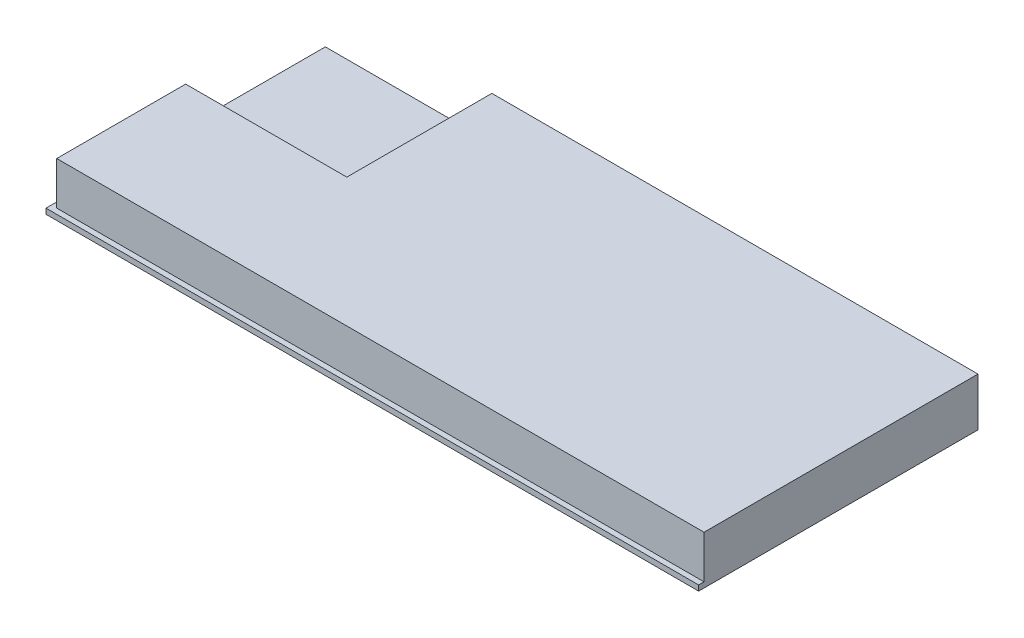
ISO-10303-21;
HEADER;
FILE_DESCRIPTION(('STEP AP214'),'2;1');
FILE_NAME('part.step','',(''),(''),'','','');
FILE_SCHEMA(('AUTOMOTIVE_DESIGN { 1 0 10303 214 1 1 1 1 }'));
ENDSEC;
DATA;
#1=APPLICATION_CONTEXT('core data for automotive mechanical design processes');
#2=APPLICATION_PROTOCOL_DEFINITION('international standard','automotive_design',2000,#1);
#3=PRODUCT_CONTEXT('',#1,'mechanical');
#4=PRODUCT('Part','Part','',(#3));
#5=PRODUCT_RELATED_PRODUCT_CATEGORY('part','',(#4));
#6=PRODUCT_DEFINITION_FORMATION('','',#4);
#7=PRODUCT_DEFINITION_CONTEXT('part definition',#1,'design');
#8=PRODUCT_DEFINITION('design','',#6,#7);
#9=PRODUCT_DEFINITION_SHAPE('','',#8);
#10=(LENGTH_UNIT() NAMED_UNIT(*) SI_UNIT(.MILLI.,.METRE.));
#11=(NAMED_UNIT(*) PLANE_ANGLE_UNIT() SI_UNIT($,.RADIAN.));
#12=(NAMED_UNIT(*) SI_UNIT($,.STERADIAN.) SOLID_ANGLE_UNIT());
#13=UNCERTAINTY_MEASURE_WITH_UNIT(LENGTH_MEASURE(1.E-05),#10,'distance_accuracy_value','');
#14=(GEOMETRIC_REPRESENTATION_CONTEXT(3) GLOBAL_UNCERTAINTY_ASSIGNED_CONTEXT((#13)) GLOBAL_UNIT_ASSIGNED_CONTEXT((#10,
#11,#12)) REPRESENTATION_CONTEXT('',''));
#15=CARTESIAN_POINT('',(0.,0.,0.));
#16=DIRECTION('',(0.,0.,1.));
#17=DIRECTION('',(1.,0.,0.));
#18=AXIS2_PLACEMENT_3D('',#15,#16,#17);
#19=CARTESIAN_POINT('',(0.,50.,0.));
#20=DIRECTION('',(0.,-1.,0.));
#21=DIRECTION('',(0.,0.,-1.));
#22=AXIS2_PLACEMENT_3D('',#19,#20,#21);
#23=PLANE('',#22);
#24=DIRECTION('',(1.,0.,0.));
#25=VECTOR('',#24,1.);
#26=CARTESIAN_POINT('',(0.,50.,1250.));
#27=LINE('',#26,#25);
#28=CARTESIAN_POINT('',(-6025.,50.,1250.));
#29=VERTEX_POINT('',#28);
#30=CARTESIAN_POINT('',(0.,50.,1250.));
#31=VERTEX_POINT('',#30);
#32=EDGE_CURVE('E57',#29,#31,#27,.T.);
#33=ORIENTED_EDGE('',*,*,#32,.F.);
#34=DIRECTION('',(0.,0.,1.));
#35=VECTOR('',#34,1.);
#36=CARTESIAN_POINT('',(-6025.,50.,1250.));
#37=LINE('',#36,#35);
#38=CARTESIAN_POINT('',(-6025.,50.,50.));
#39=VERTEX_POINT('',#38);
#40=EDGE_CURVE('E58',#39,#29,#37,.T.);
#41=ORIENTED_EDGE('',*,*,#40,.F.);
#42=DIRECTION('',(-1.,0.,0.));
#43=VECTOR('',#42,1.);
#44=CARTESIAN_POINT('',(-6025.,50.,50.));
#45=LINE('',#44,#43);
#46=CARTESIAN_POINT('',(-4525.,50.,50.));
#47=VERTEX_POINT('',#46);
#48=EDGE_CURVE('E188',#47,#39,#45,.T.);
#49=ORIENTED_EDGE('',*,*,#48,.F.);
#50=DIRECTION('',(0.,0.,1.));
#51=VECTOR('',#50,1.);
#52=CARTESIAN_POINT('',(-4525.,50.,50.));
#53=LINE('',#52,#51);
#54=CARTESIAN_POINT('',(-4525.,50.,-1300.));
#55=VERTEX_POINT('',#54);
#56=EDGE_CURVE('E200',#55,#47,#53,.T.);
#57=ORIENTED_EDGE('',*,*,#56,.F.);
#58=DIRECTION('',(-1.,0.,0.));
#59=VECTOR('',#58,1.);
#60=CARTESIAN_POINT('',(-6075.,50.,-1300.));
#61=LINE('',#60,#59);
#62=CARTESIAN_POINT('',(-6075.,50.,-1300.));
#63=VERTEX_POINT('',#62);
#64=EDGE_CURVE('E132',#55,#63,#61,.T.);
#65=ORIENTED_EDGE('',*,*,#64,.T.);
#66=DIRECTION('',(0.,0.,1.));
#67=VECTOR('',#66,1.);
#68=CARTESIAN_POINT('',(-6075.,50.,1300.));
#69=LINE('',#68,#67);
#70=CARTESIAN_POINT('',(-6075.,50.,1300.));
#71=VERTEX_POINT('',#70);
#72=EDGE_CURVE('E150',#63,#71,#69,.T.);
#73=ORIENTED_EDGE('',*,*,#72,.T.);
#74=DIRECTION('',(1.,0.,0.));
#75=VECTOR('',#74,1.);
#76=CARTESIAN_POINT('',(-6075.,50.,1300.));
#77=LINE('',#76,#75);
#78=CARTESIAN_POINT('',(0.,50.,1300.));
#79=VERTEX_POINT('',#78);
#80=EDGE_CURVE('E149',#71,#79,#77,.T.);
#81=ORIENTED_EDGE('',*,*,#80,.T.);
#82=DIRECTION('',(0.,0.,-1.));
#83=VECTOR('',#82,1.);
#84=CARTESIAN_POINT('',(0.,50.,1300.));
#85=LINE('',#84,#83);
#86=EDGE_CURVE('E141',#79,#31,#85,.T.);
#87=ORIENTED_EDGE('',*,*,#86,.T.);
#88=EDGE_LOOP('',(#33,#41,#49,#57,#65,#73,#81,#87));
#89=FACE_BOUND('',#88,.T.);
#90=ADVANCED_FACE('F41',(#89),#23,.F.);
#91=CARTESIAN_POINT('',(0.,50.,1300.));
#92=DIRECTION('',(-1.,0.,0.));
#93=DIRECTION('',(0.,0.,1.));
#94=AXIS2_PLACEMENT_3D('',#91,#92,#93);
#95=PLANE('',#94);
#96=DIRECTION('',(0.,0.,-1.));
#97=VECTOR('',#96,1.);
#98=CARTESIAN_POINT('',(0.,0.,1300.));
#99=LINE('',#98,#97);
#100=CARTESIAN_POINT('',(0.,0.,1300.));
#101=VERTEX_POINT('',#100);
#102=CARTESIAN_POINT('',(0.,0.,-1300.));
#103=VERTEX_POINT('',#102);
#104=EDGE_CURVE('E135',#101,#103,#99,.T.);
#105=ORIENTED_EDGE('',*,*,#104,.T.);
#106=DIRECTION('',(0.,-1.,0.));
#107=VECTOR('',#106,1.);
#108=CARTESIAN_POINT('',(0.,50.,-1300.));
#109=LINE('',#108,#107);
#110=CARTESIAN_POINT('',(0.,450.,-1300.));
#111=VERTEX_POINT('',#110);
#112=EDGE_CURVE('E11',#111,#103,#109,.T.);
#113=ORIENTED_EDGE('',*,*,#112,.F.);
#114=DIRECTION('',(0.,0.,-1.));
#115=VECTOR('',#114,1.);
#116=CARTESIAN_POINT('',(0.,450.,-1300.));
#117=LINE('',#116,#115);
#118=CARTESIAN_POINT('',(0.,450.,1250.));
#119=VERTEX_POINT('',#118);
#120=EDGE_CURVE('E130',#119,#111,#117,.T.);
#121=ORIENTED_EDGE('',*,*,#120,.F.);
#122=DIRECTION('',(0.,-1.,0.));
#123=VECTOR('',#122,1.);
#124=CARTESIAN_POINT('',(0.,450.,1250.));
#125=LINE('',#124,#123);
#126=EDGE_CURVE('E179',#119,#31,#125,.T.);
#127=ORIENTED_EDGE('',*,*,#126,.T.);
#128=ORIENTED_EDGE('',*,*,#86,.F.);
#129=DIRECTION('',(0.,-1.,0.));
#130=VECTOR('',#129,1.);
#131=CARTESIAN_POINT('',(0.,50.,1300.));
#132=LINE('',#131,#130);
#133=EDGE_CURVE('E147',#79,#101,#132,.T.);
#134=ORIENTED_EDGE('',*,*,#133,.T.);
#135=EDGE_LOOP('',(#105,#113,#121,#127,#128,#134));
#136=FACE_BOUND('',#135,.T.);
#137=ADVANCED_FACE('F43',(#136),#95,.F.);
#138=CARTESIAN_POINT('',(-6075.,50.,-1300.));
#139=DIRECTION('',(0.,0.,1.));
#140=DIRECTION('',(1.,0.,0.));
#141=AXIS2_PLACEMENT_3D('',#138,#139,#140);
#142=PLANE('',#141);
#143=DIRECTION('',(-1.,0.,0.));
#144=VECTOR('',#143,1.);
#145=CARTESIAN_POINT('',(-6075.,0.,-1300.));
#146=LINE('',#145,#144);
#147=CARTESIAN_POINT('',(-6075.,0.,-1300.));
#148=VERTEX_POINT('',#147);
#149=EDGE_CURVE('E137',#103,#148,#146,.T.);
#150=ORIENTED_EDGE('',*,*,#149,.T.);
#151=DIRECTION('',(0.,-1.,0.));
#152=VECTOR('',#151,1.);
#153=CARTESIAN_POINT('',(-6075.,50.,-1300.));
#154=LINE('',#153,#152);
#155=EDGE_CURVE('E47',#63,#148,#154,.T.);
#156=ORIENTED_EDGE('',*,*,#155,.F.);
#157=ORIENTED_EDGE('',*,*,#64,.F.);
#158=DIRECTION('',(0.,-1.,0.));
#159=VECTOR('',#158,1.);
#160=CARTESIAN_POINT('',(-4525.,450.,-1300.));
#161=LINE('',#160,#159);
#162=CARTESIAN_POINT('',(-4525.,450.,-1300.));
#163=VERTEX_POINT('',#162);
#164=EDGE_CURVE('E113',#163,#55,#161,.T.);
#165=ORIENTED_EDGE('',*,*,#164,.F.);
#166=DIRECTION('',(-1.,0.,0.));
#167=VECTOR('',#166,1.);
#168=CARTESIAN_POINT('',(-4525.,450.,-1300.));
#169=LINE('',#168,#167);
#170=EDGE_CURVE('E121',#111,#163,#169,.T.);
#171=ORIENTED_EDGE('',*,*,#170,.F.);
#172=ORIENTED_EDGE('',*,*,#112,.T.);
#173=EDGE_LOOP('',(#150,#156,#157,#165,#171,#172));
#174=FACE_BOUND('',#173,.T.);
#175=ADVANCED_FACE('F133',(#174),#142,.F.);
#176=CARTESIAN_POINT('',(-6075.,50.,1300.));
#177=DIRECTION('',(1.,0.,0.));
#178=DIRECTION('',(0.,0.,-1.));
#179=AXIS2_PLACEMENT_3D('',#176,#177,#178);
#180=PLANE('',#179);
#181=DIRECTION('',(0.,0.,1.));
#182=VECTOR('',#181,1.);
#183=CARTESIAN_POINT('',(-6075.,0.,1300.));
#184=LINE('',#183,#182);
#185=CARTESIAN_POINT('',(-6075.,0.,1300.));
#186=VERTEX_POINT('',#185);
#187=EDGE_CURVE('E153',#148,#186,#184,.T.);
#188=ORIENTED_EDGE('',*,*,#187,.T.);
#189=DIRECTION('',(0.,-1.,0.));
#190=VECTOR('',#189,1.);
#191=CARTESIAN_POINT('',(-6075.,50.,1300.));
#192=LINE('',#191,#190);
#193=EDGE_CURVE('E158',#71,#186,#192,.T.);
#194=ORIENTED_EDGE('',*,*,#193,.F.);
#195=ORIENTED_EDGE('',*,*,#72,.F.);
#196=ORIENTED_EDGE('',*,*,#155,.T.);
#197=EDGE_LOOP('',(#188,#194,#195,#196));
#198=FACE_BOUND('',#197,.T.);
#199=ADVANCED_FACE('F163',(#198),#180,.F.);
#200=CARTESIAN_POINT('',(-6075.,50.,1300.));
#201=DIRECTION('',(0.,0.,-1.));
#202=DIRECTION('',(-1.,0.,0.));
#203=AXIS2_PLACEMENT_3D('',#200,#201,#202);
#204=PLANE('',#203);
#205=DIRECTION('',(1.,0.,0.));
#206=VECTOR('',#205,1.);
#207=CARTESIAN_POINT('',(-6075.,0.,1300.));
#208=LINE('',#207,#206);
#209=EDGE_CURVE('E144',#186,#101,#208,.T.);
#210=ORIENTED_EDGE('',*,*,#209,.T.);
#211=ORIENTED_EDGE('',*,*,#133,.F.);
#212=ORIENTED_EDGE('',*,*,#80,.F.);
#213=ORIENTED_EDGE('',*,*,#193,.T.);
#214=EDGE_LOOP('',(#210,#211,#212,#213));
#215=FACE_BOUND('',#214,.T.);
#216=ADVANCED_FACE('F174',(#215),#204,.F.);
#217=CARTESIAN_POINT('',(0.,0.,0.));
#218=DIRECTION('',(0.,-1.,0.));
#219=DIRECTION('',(0.,0.,-1.));
#220=AXIS2_PLACEMENT_3D('',#217,#218,#219);
#221=PLANE('',#220);
#222=ORIENTED_EDGE('',*,*,#104,.F.);
#223=ORIENTED_EDGE('',*,*,#209,.F.);
#224=ORIENTED_EDGE('',*,*,#187,.F.);
#225=ORIENTED_EDGE('',*,*,#149,.F.);
#226=EDGE_LOOP('',(#222,#223,#224,#225));
#227=FACE_BOUND('',#226,.T.);
#228=ADVANCED_FACE('F166',(#227),#221,.T.);
#229=CARTESIAN_POINT('',(-4525.,450.,50.));
#230=DIRECTION('',(1.,0.,0.));
#231=DIRECTION('',(0.,0.,-1.));
#232=AXIS2_PLACEMENT_3D('',#229,#230,#231);
#233=PLANE('',#232);
#234=ORIENTED_EDGE('',*,*,#56,.T.);
#235=DIRECTION('',(0.,-1.,0.));
#236=VECTOR('',#235,1.);
#237=CARTESIAN_POINT('',(-4525.,450.,50.));
#238=LINE('',#237,#236);
#239=CARTESIAN_POINT('',(-4525.,450.,50.));
#240=VERTEX_POINT('',#239);
#241=EDGE_CURVE('E119',#240,#47,#238,.T.);
#242=ORIENTED_EDGE('',*,*,#241,.F.);
#243=DIRECTION('',(0.,0.,1.));
#244=VECTOR('',#243,1.);
#245=CARTESIAN_POINT('',(-4525.,450.,50.));
#246=LINE('',#245,#244);
#247=EDGE_CURVE('E109',#163,#240,#246,.T.);
#248=ORIENTED_EDGE('',*,*,#247,.F.);
#249=ORIENTED_EDGE('',*,*,#164,.T.);
#250=EDGE_LOOP('',(#234,#242,#248,#249));
#251=FACE_BOUND('',#250,.T.);
#252=ADVANCED_FACE('F114',(#251),#233,.F.);
#253=CARTESIAN_POINT('',(-6025.,450.,50.));
#254=DIRECTION('',(0.,0.,1.));
#255=DIRECTION('',(1.,0.,0.));
#256=AXIS2_PLACEMENT_3D('',#253,#254,#255);
#257=PLANE('',#256);
#258=ORIENTED_EDGE('',*,*,#48,.T.);
#259=DIRECTION('',(0.,-1.,0.));
#260=VECTOR('',#259,1.);
#261=CARTESIAN_POINT('',(-6025.,450.,50.));
#262=LINE('',#261,#260);
#263=CARTESIAN_POINT('',(-6025.,450.,50.));
#264=VERTEX_POINT('',#263);
#265=EDGE_CURVE('E138',#264,#39,#262,.T.);
#266=ORIENTED_EDGE('',*,*,#265,.F.);
#267=DIRECTION('',(-1.,0.,0.));
#268=VECTOR('',#267,1.);
#269=CARTESIAN_POINT('',(-6025.,450.,50.));
#270=LINE('',#269,#268);
#271=EDGE_CURVE('E116',#240,#264,#270,.T.);
#272=ORIENTED_EDGE('',*,*,#271,.F.);
#273=ORIENTED_EDGE('',*,*,#241,.T.);
#274=EDGE_LOOP('',(#258,#266,#272,#273));
#275=FACE_BOUND('',#274,.T.);
#276=ADVANCED_FACE('F196',(#275),#257,.F.);
#277=CARTESIAN_POINT('',(-6025.,450.,1250.));
#278=DIRECTION('',(1.,0.,0.));
#279=DIRECTION('',(0.,0.,-1.));
#280=AXIS2_PLACEMENT_3D('',#277,#278,#279);
#281=PLANE('',#280);
#282=ORIENTED_EDGE('',*,*,#40,.T.);
#283=DIRECTION('',(0.,-1.,0.));
#284=VECTOR('',#283,1.);
#285=CARTESIAN_POINT('',(-6025.,450.,1250.));
#286=LINE('',#285,#284);
#287=CARTESIAN_POINT('',(-6025.,450.,1250.));
#288=VERTEX_POINT('',#287);
#289=EDGE_CURVE('E184',#288,#29,#286,.T.);
#290=ORIENTED_EDGE('',*,*,#289,.F.);
#291=DIRECTION('',(0.,0.,1.));
#292=VECTOR('',#291,1.);
#293=CARTESIAN_POINT('',(-6025.,450.,1250.));
#294=LINE('',#293,#292);
#295=EDGE_CURVE('E198',#264,#288,#294,.T.);
#296=ORIENTED_EDGE('',*,*,#295,.F.);
#297=ORIENTED_EDGE('',*,*,#265,.T.);
#298=EDGE_LOOP('',(#282,#290,#296,#297));
#299=FACE_BOUND('',#298,.T.);
#300=ADVANCED_FACE('F195',(#299),#281,.F.);
#301=CARTESIAN_POINT('',(0.,450.,1250.));
#302=DIRECTION('',(0.,0.,-1.));
#303=DIRECTION('',(-1.,0.,0.));
#304=AXIS2_PLACEMENT_3D('',#301,#302,#303);
#305=PLANE('',#304);
#306=ORIENTED_EDGE('',*,*,#32,.T.);
#307=ORIENTED_EDGE('',*,*,#126,.F.);
#308=DIRECTION('',(1.,0.,0.));
#309=VECTOR('',#308,1.);
#310=CARTESIAN_POINT('',(0.,450.,1250.));
#311=LINE('',#310,#309);
#312=EDGE_CURVE('E201',#288,#119,#311,.T.);
#313=ORIENTED_EDGE('',*,*,#312,.F.);
#314=ORIENTED_EDGE('',*,*,#289,.T.);
#315=EDGE_LOOP('',(#306,#307,#313,#314));
#316=FACE_BOUND('',#315,.T.);
#317=ADVANCED_FACE('F182',(#316),#305,.F.);
#318=CARTESIAN_POINT('',(0.,450.,0.));
#319=DIRECTION('',(0.,-1.,0.));
#320=DIRECTION('',(0.,0.,-1.));
#321=AXIS2_PLACEMENT_3D('',#318,#319,#320);
#322=PLANE('',#321);
#323=ORIENTED_EDGE('',*,*,#170,.T.);
#324=ORIENTED_EDGE('',*,*,#247,.T.);
#325=ORIENTED_EDGE('',*,*,#271,.T.);
#326=ORIENTED_EDGE('',*,*,#295,.T.);
#327=ORIENTED_EDGE('',*,*,#312,.T.);
#328=ORIENTED_EDGE('',*,*,#120,.T.);
#329=EDGE_LOOP('',(#323,#324,#325,#326,#327,#328));
#330=FACE_BOUND('',#329,.T.);
#331=ADVANCED_FACE('F125',(#330),#322,.F.);
#332=CLOSED_SHELL('',(#90,#137,#175,#199,#216,#228,#252,#276,#300,#317,#331));
#333=MANIFOLD_SOLID_BREP('B2',#332);
#334=ADVANCED_BREP_SHAPE_REPRESENTATION('',(#18,#333),#14);
#335=SHAPE_DEFINITION_REPRESENTATION(#9,#334);
ENDSEC;
END-ISO-10303-21;
